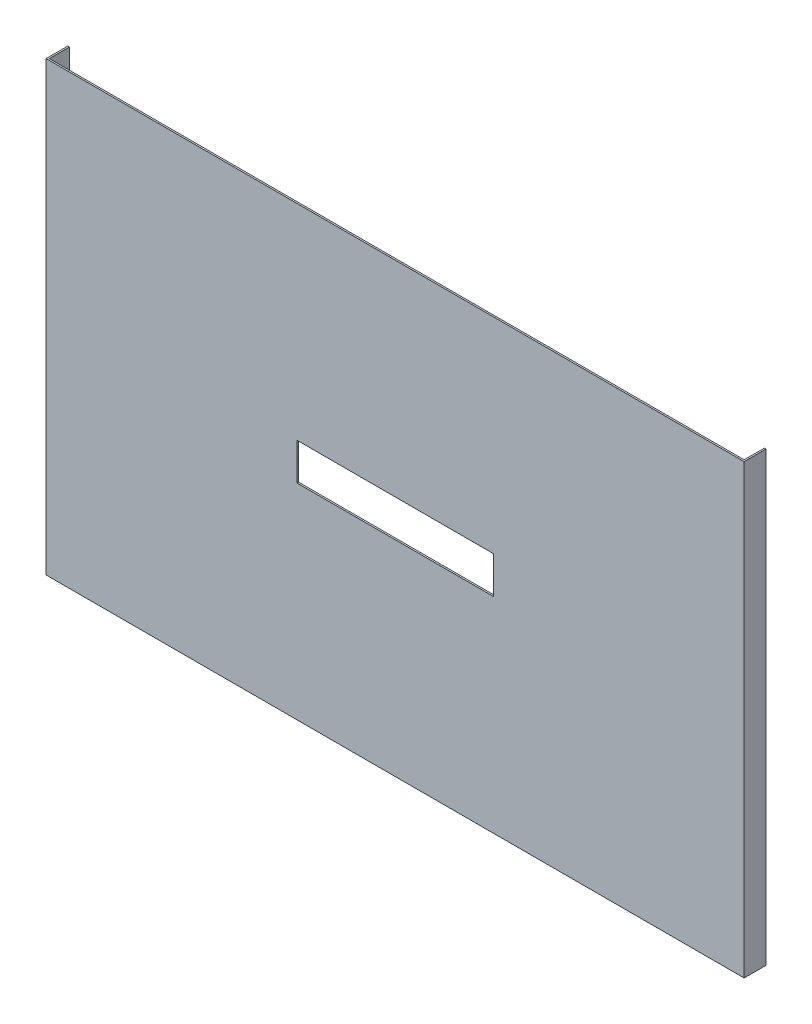
ISO-10303-21;
HEADER;
FILE_DESCRIPTION(('STEP AP214'),'2;1');
FILE_NAME('part.step','',(''),(''),'','','');
FILE_SCHEMA(('AUTOMOTIVE_DESIGN { 1 0 10303 214 1 1 1 1 }'));
ENDSEC;
DATA;
#1=APPLICATION_CONTEXT('core data for automotive mechanical design processes');
#2=APPLICATION_PROTOCOL_DEFINITION('international standard','automotive_design',2000,#1);
#3=PRODUCT_CONTEXT('',#1,'mechanical');
#4=PRODUCT('Part','Part','',(#3));
#5=PRODUCT_RELATED_PRODUCT_CATEGORY('part','',(#4));
#6=PRODUCT_DEFINITION_FORMATION('','',#4);
#7=PRODUCT_DEFINITION_CONTEXT('part definition',#1,'design');
#8=PRODUCT_DEFINITION('design','',#6,#7);
#9=PRODUCT_DEFINITION_SHAPE('','',#8);
#10=(LENGTH_UNIT() NAMED_UNIT(*) SI_UNIT(.MILLI.,.METRE.));
#11=(NAMED_UNIT(*) PLANE_ANGLE_UNIT() SI_UNIT($,.RADIAN.));
#12=(NAMED_UNIT(*) SI_UNIT($,.STERADIAN.) SOLID_ANGLE_UNIT());
#13=UNCERTAINTY_MEASURE_WITH_UNIT(LENGTH_MEASURE(1.E-05),#10,'distance_accuracy_value','');
#14=(GEOMETRIC_REPRESENTATION_CONTEXT(3) GLOBAL_UNCERTAINTY_ASSIGNED_CONTEXT((#13)) GLOBAL_UNIT_ASSIGNED_CONTEXT((#10,
#11,#12)) REPRESENTATION_CONTEXT('',''));
#15=CARTESIAN_POINT('',(0.,0.,0.));
#16=DIRECTION('',(0.,0.,1.));
#17=DIRECTION('',(1.,0.,0.));
#18=AXIS2_PLACEMENT_3D('',#15,#16,#17);
#19=CARTESIAN_POINT('',(670.,1560.,40.));
#20=DIRECTION('',(0.,0.,-1.));
#21=DIRECTION('',(-1.,0.,0.));
#22=AXIS2_PLACEMENT_3D('',#19,#20,#21);
#23=PLANE('',#22);
#24=DIRECTION('',(1.,0.,0.));
#25=VECTOR('',#24,1.);
#26=CARTESIAN_POINT('',(670.,1150.,40.));
#27=LINE('',#26,#25);
#28=CARTESIAN_POINT('',(30.,1150.,40.));
#29=VERTEX_POINT('',#28);
#30=CARTESIAN_POINT('',(670.,1150.,40.));
#31=VERTEX_POINT('',#30);
#32=EDGE_CURVE('E141',#29,#31,#27,.T.);
#33=ORIENTED_EDGE('',*,*,#32,.T.);
#34=DIRECTION('',(0.,-1.,0.));
#35=VECTOR('',#34,1.);
#36=CARTESIAN_POINT('',(670.,1560.,40.));
#37=LINE('',#36,#35);
#38=CARTESIAN_POINT('',(670.,1560.,40.));
#39=VERTEX_POINT('',#38);
#40=EDGE_CURVE('E200',#39,#31,#37,.T.);
#41=ORIENTED_EDGE('',*,*,#40,.F.);
#42=DIRECTION('',(1.,0.,0.));
#43=VECTOR('',#42,1.);
#44=CARTESIAN_POINT('',(670.,1560.,40.));
#45=LINE('',#44,#43);
#46=CARTESIAN_POINT('',(30.,1560.,40.));
#47=VERTEX_POINT('',#46);
#48=EDGE_CURVE('E149',#47,#39,#45,.T.);
#49=ORIENTED_EDGE('',*,*,#48,.F.);
#50=DIRECTION('',(0.,-1.,0.));
#51=VECTOR('',#50,1.);
#52=CARTESIAN_POINT('',(30.,1560.,40.));
#53=LINE('',#52,#51);
#54=EDGE_CURVE('E166',#47,#29,#53,.T.);
#55=ORIENTED_EDGE('',*,*,#54,.T.);
#56=EDGE_LOOP('',(#33,#41,#49,#55));
#57=FACE_BOUND('',#56,.T.);
#58=DIRECTION('',(0.,-1.,0.));
#59=VECTOR('',#58,1.);
#60=CARTESIAN_POINT('',(260.,1560.,40.));
#61=LINE('',#60,#59);
#62=CARTESIAN_POINT('',(260.,1372.,40.));
#63=VERTEX_POINT('',#62);
#64=CARTESIAN_POINT('',(260.,1338.,40.));
#65=VERTEX_POINT('',#64);
#66=EDGE_CURVE('E134',#63,#65,#61,.T.);
#67=ORIENTED_EDGE('',*,*,#66,.F.);
#68=DIRECTION('',(-1.,0.,0.));
#69=VECTOR('',#68,1.);
#70=CARTESIAN_POINT('',(670.,1372.,40.));
#71=LINE('',#70,#69);
#72=CARTESIAN_POINT('',(440.,1372.,40.));
#73=VERTEX_POINT('',#72);
#74=EDGE_CURVE('E123',#73,#63,#71,.T.);
#75=ORIENTED_EDGE('',*,*,#74,.F.);
#76=DIRECTION('',(0.,1.,0.));
#77=VECTOR('',#76,1.);
#78=CARTESIAN_POINT('',(440.,1560.,40.));
#79=LINE('',#78,#77);
#80=CARTESIAN_POINT('',(440.,1338.,40.));
#81=VERTEX_POINT('',#80);
#82=EDGE_CURVE('E128',#81,#73,#79,.T.);
#83=ORIENTED_EDGE('',*,*,#82,.F.);
#84=DIRECTION('',(1.,0.,0.));
#85=VECTOR('',#84,1.);
#86=CARTESIAN_POINT('',(670.,1338.,40.));
#87=LINE('',#86,#85);
#88=EDGE_CURVE('E140',#65,#81,#87,.T.);
#89=ORIENTED_EDGE('',*,*,#88,.F.);
#90=EDGE_LOOP('',(#67,#75,#83,#89));
#91=FACE_BOUND('',#90,.T.);
#92=ADVANCED_FACE('F39',(#57,#91),#23,.F.);
#93=CARTESIAN_POINT('',(31.5,1560.,38.5));
#94=DIRECTION('',(0.,0.,1.));
#95=DIRECTION('',(1.,0.,0.));
#96=AXIS2_PLACEMENT_3D('',#93,#94,#95);
#97=PLANE('',#96);
#98=DIRECTION('',(-1.,0.,0.));
#99=VECTOR('',#98,1.);
#100=CARTESIAN_POINT('',(31.5,1150.,38.5));
#101=LINE('',#100,#99);
#102=CARTESIAN_POINT('',(668.5,1150.,38.5));
#103=VERTEX_POINT('',#102);
#104=CARTESIAN_POINT('',(31.5,1150.,38.5));
#105=VERTEX_POINT('',#104);
#106=EDGE_CURVE('E173',#103,#105,#101,.T.);
#107=ORIENTED_EDGE('',*,*,#106,.T.);
#108=DIRECTION('',(0.,-1.,0.));
#109=VECTOR('',#108,1.);
#110=CARTESIAN_POINT('',(31.5,1560.,38.5));
#111=LINE('',#110,#109);
#112=CARTESIAN_POINT('',(31.5,1560.,38.5));
#113=VERTEX_POINT('',#112);
#114=EDGE_CURVE('E188',#113,#105,#111,.T.);
#115=ORIENTED_EDGE('',*,*,#114,.F.);
#116=DIRECTION('',(-1.,0.,0.));
#117=VECTOR('',#116,1.);
#118=CARTESIAN_POINT('',(31.5,1560.,38.5));
#119=LINE('',#118,#117);
#120=CARTESIAN_POINT('',(668.5,1560.,38.5));
#121=VERTEX_POINT('',#120);
#122=EDGE_CURVE('E159',#121,#113,#119,.T.);
#123=ORIENTED_EDGE('',*,*,#122,.F.);
#124=DIRECTION('',(0.,-1.,0.));
#125=VECTOR('',#124,1.);
#126=CARTESIAN_POINT('',(668.5,1560.,38.5));
#127=LINE('',#126,#125);
#128=EDGE_CURVE('E191',#121,#103,#127,.T.);
#129=ORIENTED_EDGE('',*,*,#128,.T.);
#130=EDGE_LOOP('',(#107,#115,#123,#129));
#131=FACE_BOUND('',#130,.T.);
#132=DIRECTION('',(0.,1.,0.));
#133=VECTOR('',#132,1.);
#134=CARTESIAN_POINT('',(260.,1560.,38.5));
#135=LINE('',#134,#133);
#136=CARTESIAN_POINT('',(260.,1338.,38.5));
#137=VERTEX_POINT('',#136);
#138=CARTESIAN_POINT('',(260.,1372.,38.5));
#139=VERTEX_POINT('',#138);
#140=EDGE_CURVE('E11',#137,#139,#135,.T.);
#141=ORIENTED_EDGE('',*,*,#140,.F.);
#142=DIRECTION('',(-1.,0.,0.));
#143=VECTOR('',#142,1.);
#144=CARTESIAN_POINT('',(31.5,1338.,38.5));
#145=LINE('',#144,#143);
#146=CARTESIAN_POINT('',(440.,1338.,38.5));
#147=VERTEX_POINT('',#146);
#148=EDGE_CURVE('E46',#147,#137,#145,.T.);
#149=ORIENTED_EDGE('',*,*,#148,.F.);
#150=DIRECTION('',(0.,-1.,0.));
#151=VECTOR('',#150,1.);
#152=CARTESIAN_POINT('',(440.,1560.,38.5));
#153=LINE('',#152,#151);
#154=CARTESIAN_POINT('',(440.,1372.,38.5));
#155=VERTEX_POINT('',#154);
#156=EDGE_CURVE('E205',#155,#147,#153,.T.);
#157=ORIENTED_EDGE('',*,*,#156,.F.);
#158=DIRECTION('',(1.,0.,0.));
#159=VECTOR('',#158,1.);
#160=CARTESIAN_POINT('',(31.5,1372.,38.5));
#161=LINE('',#160,#159);
#162=EDGE_CURVE('E203',#139,#155,#161,.T.);
#163=ORIENTED_EDGE('',*,*,#162,.F.);
#164=EDGE_LOOP('',(#141,#149,#157,#163));
#165=FACE_BOUND('',#164,.T.);
#166=ADVANCED_FACE('F215',(#131,#165),#97,.F.);
#167=CARTESIAN_POINT('',(670.,1560.,20.));
#168=DIRECTION('',(-1.,0.,0.));
#169=DIRECTION('',(0.,0.,1.));
#170=AXIS2_PLACEMENT_3D('',#167,#168,#169);
#171=PLANE('',#170);
#172=DIRECTION('',(0.,0.,-1.));
#173=VECTOR('',#172,1.);
#174=CARTESIAN_POINT('',(670.,1150.,20.));
#175=LINE('',#174,#173);
#176=CARTESIAN_POINT('',(670.,1150.,20.));
#177=VERTEX_POINT('',#176);
#178=EDGE_CURVE('E144',#31,#177,#175,.T.);
#179=ORIENTED_EDGE('',*,*,#178,.T.);
#180=DIRECTION('',(0.,-1.,0.));
#181=VECTOR('',#180,1.);
#182=CARTESIAN_POINT('',(670.,1560.,20.));
#183=LINE('',#182,#181);
#184=CARTESIAN_POINT('',(670.,1560.,20.));
#185=VERTEX_POINT('',#184);
#186=EDGE_CURVE('E197',#185,#177,#183,.T.);
#187=ORIENTED_EDGE('',*,*,#186,.F.);
#188=DIRECTION('',(0.,0.,-1.));
#189=VECTOR('',#188,1.);
#190=CARTESIAN_POINT('',(670.,1560.,20.));
#191=LINE('',#190,#189);
#192=EDGE_CURVE('E152',#39,#185,#191,.T.);
#193=ORIENTED_EDGE('',*,*,#192,.F.);
#194=ORIENTED_EDGE('',*,*,#40,.T.);
#195=EDGE_LOOP('',(#179,#187,#193,#194));
#196=FACE_BOUND('',#195,.T.);
#197=ADVANCED_FACE('F234',(#196),#171,.F.);
#198=CARTESIAN_POINT('',(668.5,1560.,20.));
#199=DIRECTION('',(0.,0.,1.));
#200=DIRECTION('',(1.,0.,0.));
#201=AXIS2_PLACEMENT_3D('',#198,#199,#200);
#202=PLANE('',#201);
#203=DIRECTION('',(-1.,0.,0.));
#204=VECTOR('',#203,1.);
#205=CARTESIAN_POINT('',(668.5,1150.,20.));
#206=LINE('',#205,#204);
#207=CARTESIAN_POINT('',(668.5,1150.,20.));
#208=VERTEX_POINT('',#207);
#209=EDGE_CURVE('E169',#177,#208,#206,.T.);
#210=ORIENTED_EDGE('',*,*,#209,.T.);
#211=DIRECTION('',(0.,-1.,0.));
#212=VECTOR('',#211,1.);
#213=CARTESIAN_POINT('',(668.5,1560.,20.));
#214=LINE('',#213,#212);
#215=CARTESIAN_POINT('',(668.5,1560.,20.));
#216=VERTEX_POINT('',#215);
#217=EDGE_CURVE('E194',#216,#208,#214,.T.);
#218=ORIENTED_EDGE('',*,*,#217,.F.);
#219=DIRECTION('',(-1.,0.,0.));
#220=VECTOR('',#219,1.);
#221=CARTESIAN_POINT('',(668.5,1560.,20.));
#222=LINE('',#221,#220);
#223=EDGE_CURVE('E155',#185,#216,#222,.T.);
#224=ORIENTED_EDGE('',*,*,#223,.F.);
#225=ORIENTED_EDGE('',*,*,#186,.T.);
#226=EDGE_LOOP('',(#210,#218,#224,#225));
#227=FACE_BOUND('',#226,.T.);
#228=ADVANCED_FACE('F273',(#227),#202,.F.);
#229=CARTESIAN_POINT('',(668.5,1560.,38.5));
#230=DIRECTION('',(1.,0.,0.));
#231=DIRECTION('',(0.,0.,-1.));
#232=AXIS2_PLACEMENT_3D('',#229,#230,#231);
#233=PLANE('',#232);
#234=DIRECTION('',(0.,0.,1.));
#235=VECTOR('',#234,1.);
#236=CARTESIAN_POINT('',(668.5,1150.,38.5));
#237=LINE('',#236,#235);
#238=EDGE_CURVE('E171',#208,#103,#237,.T.);
#239=ORIENTED_EDGE('',*,*,#238,.T.);
#240=ORIENTED_EDGE('',*,*,#128,.F.);
#241=DIRECTION('',(0.,0.,1.));
#242=VECTOR('',#241,1.);
#243=CARTESIAN_POINT('',(668.5,1560.,38.5));
#244=LINE('',#243,#242);
#245=EDGE_CURVE('E157',#216,#121,#244,.T.);
#246=ORIENTED_EDGE('',*,*,#245,.F.);
#247=ORIENTED_EDGE('',*,*,#217,.T.);
#248=EDGE_LOOP('',(#239,#240,#246,#247));
#249=FACE_BOUND('',#248,.T.);
#250=ADVANCED_FACE('F270',(#249),#233,.F.);
#251=CARTESIAN_POINT('',(31.5,1560.,20.));
#252=DIRECTION('',(-1.,0.,0.));
#253=DIRECTION('',(0.,0.,1.));
#254=AXIS2_PLACEMENT_3D('',#251,#252,#253);
#255=PLANE('',#254);
#256=DIRECTION('',(0.,0.,-1.));
#257=VECTOR('',#256,1.);
#258=CARTESIAN_POINT('',(31.5,1150.,20.));
#259=LINE('',#258,#257);
#260=CARTESIAN_POINT('',(31.5,1150.,20.));
#261=VERTEX_POINT('',#260);
#262=EDGE_CURVE('E175',#105,#261,#259,.T.);
#263=ORIENTED_EDGE('',*,*,#262,.T.);
#264=DIRECTION('',(0.,-1.,0.));
#265=VECTOR('',#264,1.);
#266=CARTESIAN_POINT('',(31.5,1560.,20.));
#267=LINE('',#266,#265);
#268=CARTESIAN_POINT('',(31.5,1560.,20.));
#269=VERTEX_POINT('',#268);
#270=EDGE_CURVE('E185',#269,#261,#267,.T.);
#271=ORIENTED_EDGE('',*,*,#270,.F.);
#272=DIRECTION('',(0.,0.,-1.));
#273=VECTOR('',#272,1.);
#274=CARTESIAN_POINT('',(31.5,1560.,20.));
#275=LINE('',#274,#273);
#276=EDGE_CURVE('E161',#113,#269,#275,.T.);
#277=ORIENTED_EDGE('',*,*,#276,.F.);
#278=ORIENTED_EDGE('',*,*,#114,.T.);
#279=EDGE_LOOP('',(#263,#271,#277,#278));
#280=FACE_BOUND('',#279,.T.);
#281=ADVANCED_FACE('F263',(#280),#255,.F.);
#282=CARTESIAN_POINT('',(30.,1560.,20.));
#283=DIRECTION('',(0.,0.,1.));
#284=DIRECTION('',(1.,0.,0.));
#285=AXIS2_PLACEMENT_3D('',#282,#283,#284);
#286=PLANE('',#285);
#287=DIRECTION('',(-1.,0.,0.));
#288=VECTOR('',#287,1.);
#289=CARTESIAN_POINT('',(30.,1150.,20.));
#290=LINE('',#289,#288);
#291=CARTESIAN_POINT('',(30.,1150.,20.));
#292=VERTEX_POINT('',#291);
#293=EDGE_CURVE('E177',#261,#292,#290,.T.);
#294=ORIENTED_EDGE('',*,*,#293,.T.);
#295=DIRECTION('',(0.,-1.,0.));
#296=VECTOR('',#295,1.);
#297=CARTESIAN_POINT('',(30.,1560.,20.));
#298=LINE('',#297,#296);
#299=CARTESIAN_POINT('',(30.,1560.,20.));
#300=VERTEX_POINT('',#299);
#301=EDGE_CURVE('E182',#300,#292,#298,.T.);
#302=ORIENTED_EDGE('',*,*,#301,.F.);
#303=DIRECTION('',(-1.,0.,0.));
#304=VECTOR('',#303,1.);
#305=CARTESIAN_POINT('',(30.,1560.,20.));
#306=LINE('',#305,#304);
#307=EDGE_CURVE('E163',#269,#300,#306,.T.);
#308=ORIENTED_EDGE('',*,*,#307,.F.);
#309=ORIENTED_EDGE('',*,*,#270,.T.);
#310=EDGE_LOOP('',(#294,#302,#308,#309));
#311=FACE_BOUND('',#310,.T.);
#312=ADVANCED_FACE('F258',(#311),#286,.F.);
#313=CARTESIAN_POINT('',(30.,1560.,40.));
#314=DIRECTION('',(1.,0.,0.));
#315=DIRECTION('',(0.,0.,-1.));
#316=AXIS2_PLACEMENT_3D('',#313,#314,#315);
#317=PLANE('',#316);
#318=DIRECTION('',(0.,0.,1.));
#319=VECTOR('',#318,1.);
#320=CARTESIAN_POINT('',(30.,1150.,40.));
#321=LINE('',#320,#319);
#322=EDGE_CURVE('E153',#292,#29,#321,.T.);
#323=ORIENTED_EDGE('',*,*,#322,.T.);
#324=ORIENTED_EDGE('',*,*,#54,.F.);
#325=DIRECTION('',(0.,0.,1.));
#326=VECTOR('',#325,1.);
#327=CARTESIAN_POINT('',(30.,1560.,40.));
#328=LINE('',#327,#326);
#329=EDGE_CURVE('E165',#300,#47,#328,.T.);
#330=ORIENTED_EDGE('',*,*,#329,.F.);
#331=ORIENTED_EDGE('',*,*,#301,.T.);
#332=EDGE_LOOP('',(#323,#324,#330,#331));
#333=FACE_BOUND('',#332,.T.);
#334=ADVANCED_FACE('F256',(#333),#317,.F.);
#335=CARTESIAN_POINT('',(0.,1560.,0.));
#336=DIRECTION('',(0.,-1.,0.));
#337=DIRECTION('',(0.,0.,-1.));
#338=AXIS2_PLACEMENT_3D('',#335,#336,#337);
#339=PLANE('',#338);
#340=ORIENTED_EDGE('',*,*,#48,.T.);
#341=ORIENTED_EDGE('',*,*,#192,.T.);
#342=ORIENTED_EDGE('',*,*,#223,.T.);
#343=ORIENTED_EDGE('',*,*,#245,.T.);
#344=ORIENTED_EDGE('',*,*,#122,.T.);
#345=ORIENTED_EDGE('',*,*,#276,.T.);
#346=ORIENTED_EDGE('',*,*,#307,.T.);
#347=ORIENTED_EDGE('',*,*,#329,.T.);
#348=EDGE_LOOP('',(#340,#341,#342,#343,#344,#345,#346,#347));
#349=FACE_BOUND('',#348,.T.);
#350=ADVANCED_FACE('F251',(#349),#339,.F.);
#351=CARTESIAN_POINT('',(0.,1150.,0.));
#352=DIRECTION('',(0.,-1.,0.));
#353=DIRECTION('',(0.,0.,-1.));
#354=AXIS2_PLACEMENT_3D('',#351,#352,#353);
#355=PLANE('',#354);
#356=ORIENTED_EDGE('',*,*,#32,.F.);
#357=ORIENTED_EDGE('',*,*,#322,.F.);
#358=ORIENTED_EDGE('',*,*,#293,.F.);
#359=ORIENTED_EDGE('',*,*,#262,.F.);
#360=ORIENTED_EDGE('',*,*,#106,.F.);
#361=ORIENTED_EDGE('',*,*,#238,.F.);
#362=ORIENTED_EDGE('',*,*,#209,.F.);
#363=ORIENTED_EDGE('',*,*,#178,.F.);
#364=EDGE_LOOP('',(#356,#357,#358,#359,#360,#361,#362,#363));
#365=FACE_BOUND('',#364,.T.);
#366=ADVANCED_FACE('F243',(#365),#355,.T.);
#367=CARTESIAN_POINT('',(260.,1338.,41.));
#368=DIRECTION('',(1.,0.,0.));
#369=DIRECTION('',(0.,0.,-1.));
#370=AXIS2_PLACEMENT_3D('',#367,#368,#369);
#371=PLANE('',#370);
#372=ORIENTED_EDGE('',*,*,#66,.T.);
#373=DIRECTION('',(0.,0.,-1.));
#374=VECTOR('',#373,1.);
#375=CARTESIAN_POINT('',(260.,1338.,41.));
#376=LINE('',#375,#374);
#377=EDGE_CURVE('E129',#65,#137,#376,.T.);
#378=ORIENTED_EDGE('',*,*,#377,.T.);
#379=ORIENTED_EDGE('',*,*,#140,.T.);
#380=DIRECTION('',(0.,0.,-1.));
#381=VECTOR('',#380,1.);
#382=CARTESIAN_POINT('',(260.,1372.,41.));
#383=LINE('',#382,#381);
#384=EDGE_CURVE('E58',#63,#139,#383,.T.);
#385=ORIENTED_EDGE('',*,*,#384,.F.);
#386=EDGE_LOOP('',(#372,#378,#379,#385));
#387=FACE_BOUND('',#386,.T.);
#388=ADVANCED_FACE('F132',(#387),#371,.T.);
#389=CARTESIAN_POINT('',(260.,1338.,41.));
#390=DIRECTION('',(0.,1.,0.));
#391=DIRECTION('',(0.,0.,1.));
#392=AXIS2_PLACEMENT_3D('',#389,#390,#391);
#393=PLANE('',#392);
#394=ORIENTED_EDGE('',*,*,#88,.T.);
#395=DIRECTION('',(0.,0.,-1.));
#396=VECTOR('',#395,1.);
#397=CARTESIAN_POINT('',(440.,1338.,41.));
#398=LINE('',#397,#396);
#399=EDGE_CURVE('E211',#81,#147,#398,.T.);
#400=ORIENTED_EDGE('',*,*,#399,.T.);
#401=ORIENTED_EDGE('',*,*,#148,.T.);
#402=ORIENTED_EDGE('',*,*,#377,.F.);
#403=EDGE_LOOP('',(#394,#400,#401,#402));
#404=FACE_BOUND('',#403,.T.);
#405=ADVANCED_FACE('F209',(#404),#393,.T.);
#406=CARTESIAN_POINT('',(440.,1338.,41.));
#407=DIRECTION('',(-1.,0.,0.));
#408=DIRECTION('',(0.,0.,1.));
#409=AXIS2_PLACEMENT_3D('',#406,#407,#408);
#410=PLANE('',#409);
#411=ORIENTED_EDGE('',*,*,#82,.T.);
#412=DIRECTION('',(0.,0.,-1.));
#413=VECTOR('',#412,1.);
#414=CARTESIAN_POINT('',(440.,1372.,41.));
#415=LINE('',#414,#413);
#416=EDGE_CURVE('E53',#73,#155,#415,.T.);
#417=ORIENTED_EDGE('',*,*,#416,.T.);
#418=ORIENTED_EDGE('',*,*,#156,.T.);
#419=ORIENTED_EDGE('',*,*,#399,.F.);
#420=EDGE_LOOP('',(#411,#417,#418,#419));
#421=FACE_BOUND('',#420,.T.);
#422=ADVANCED_FACE('F217',(#421),#410,.T.);
#423=CARTESIAN_POINT('',(260.,1372.,41.));
#424=DIRECTION('',(0.,-1.,0.));
#425=DIRECTION('',(0.,0.,-1.));
#426=AXIS2_PLACEMENT_3D('',#423,#424,#425);
#427=PLANE('',#426);
#428=ORIENTED_EDGE('',*,*,#74,.T.);
#429=ORIENTED_EDGE('',*,*,#384,.T.);
#430=ORIENTED_EDGE('',*,*,#162,.T.);
#431=ORIENTED_EDGE('',*,*,#416,.F.);
#432=EDGE_LOOP('',(#428,#429,#430,#431));
#433=FACE_BOUND('',#432,.T.);
#434=ADVANCED_FACE('F124',(#433),#427,.T.);
#435=CLOSED_SHELL('',(#92,#166,#197,#228,#250,#281,#312,#334,#350,#366,#388,#405,#422,#434));
#436=MANIFOLD_SOLID_BREP('B2',#435);
#437=ADVANCED_BREP_SHAPE_REPRESENTATION('',(#18,#436),#14);
#438=SHAPE_DEFINITION_REPRESENTATION(#9,#437);
ENDSEC;
END-ISO-10303-21;
